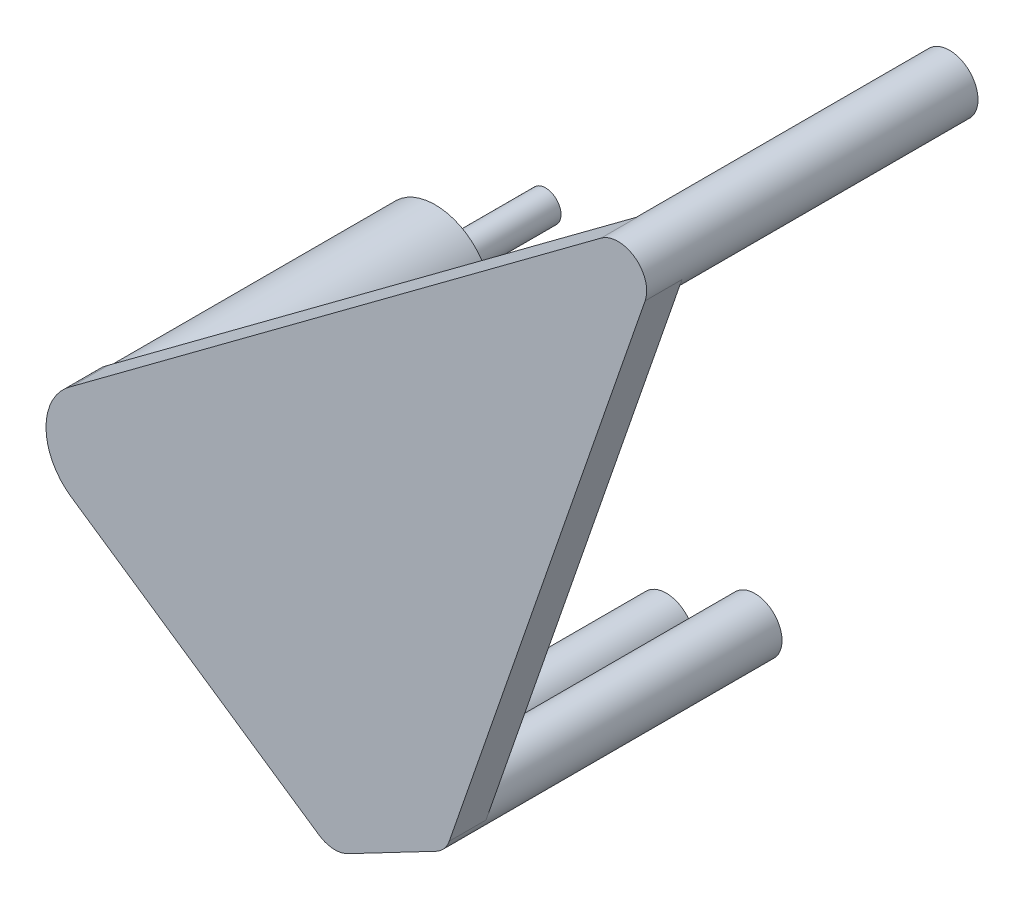
ISO-10303-21;
HEADER;
FILE_DESCRIPTION(('STEP AP214'),'2;1');
FILE_NAME('part.step','',(''),(''),'','','');
FILE_SCHEMA(('AUTOMOTIVE_DESIGN { 1 0 10303 214 1 1 1 1 }'));
ENDSEC;
DATA;
#1=APPLICATION_CONTEXT('core data for automotive mechanical design processes');
#2=APPLICATION_PROTOCOL_DEFINITION('international standard','automotive_design',2000,#1);
#3=PRODUCT_CONTEXT('',#1,'mechanical');
#4=PRODUCT('Part','Part','',(#3));
#5=PRODUCT_RELATED_PRODUCT_CATEGORY('part','',(#4));
#6=PRODUCT_DEFINITION_FORMATION('','',#4);
#7=PRODUCT_DEFINITION_CONTEXT('part definition',#1,'design');
#8=PRODUCT_DEFINITION('design','',#6,#7);
#9=PRODUCT_DEFINITION_SHAPE('','',#8);
#10=(LENGTH_UNIT() NAMED_UNIT(*) SI_UNIT(.MILLI.,.METRE.));
#11=(NAMED_UNIT(*) PLANE_ANGLE_UNIT() SI_UNIT($,.RADIAN.));
#12=(NAMED_UNIT(*) SI_UNIT($,.STERADIAN.) SOLID_ANGLE_UNIT());
#13=UNCERTAINTY_MEASURE_WITH_UNIT(LENGTH_MEASURE(1.E-05),#10,'distance_accuracy_value','');
#14=(GEOMETRIC_REPRESENTATION_CONTEXT(3) GLOBAL_UNCERTAINTY_ASSIGNED_CONTEXT((#13)) GLOBAL_UNIT_ASSIGNED_CONTEXT((#10,
#11,#12)) REPRESENTATION_CONTEXT('',''));
#15=CARTESIAN_POINT('',(0.,0.,0.));
#16=DIRECTION('',(0.,0.,1.));
#17=DIRECTION('',(1.,0.,0.));
#18=AXIS2_PLACEMENT_3D('',#15,#16,#17);
#19=CARTESIAN_POINT('',(0.,0.,35.7505));
#20=DIRECTION('',(0.,0.,1.));
#21=DIRECTION('',(1.,0.,0.));
#22=AXIS2_PLACEMENT_3D('',#19,#20,#21);
#23=PLANE('',#22);
#24=CARTESIAN_POINT('',(-135.98996462201,14.8069678189548,35.7505));
#25=DIRECTION('',(0.,0.,1.));
#26=DIRECTION('',(1.,0.,0.));
#27=AXIS2_PLACEMENT_3D('',#24,#25,#26);
#28=CIRCLE('',#27,14.5);
#29=CARTESIAN_POINT('',(-121.48996462201,14.8069678189548,35.7505));
#30=VERTEX_POINT('',#29);
#31=EDGE_CURVE('E182',#30,#30,#28,.T.);
#32=ORIENTED_EDGE('',*,*,#31,.T.);
#33=EDGE_LOOP('',(#32));
#34=FACE_BOUND('',#33,.T.);
#35=CARTESIAN_POINT('',(-2.84319901034025,123.138021162855,35.7505));
#36=DIRECTION('',(0.,0.,1.));
#37=DIRECTION('',(1.,0.,0.));
#38=AXIS2_PLACEMENT_3D('',#35,#36,#37);
#39=CIRCLE('',#38,7.40503170518328);
#40=CARTESIAN_POINT('',(4.15447512995117,120.715821505298,35.7505));
#41=VERTEX_POINT('',#40);
#42=CARTESIAN_POINT('',(-7.25833485906466,129.082856736029,35.7505));
#43=VERTEX_POINT('',#42);
#44=EDGE_CURVE('E45',#41,#43,#39,.F.);
#45=ORIENTED_EDGE('',*,*,#44,.F.);
#46=DIRECTION('',(0.327101861813902,0.944989085650136,0.));
#47=VECTOR('',#46,1.);
#48=CARTESIAN_POINT('',(-33.6042241942555,11.6318849240364,35.7505));
#49=LINE('',#48,#47);
#50=CARTESIAN_POINT('',(-46.5758038889972,-25.8426839065925,35.7505));
#51=VERTEX_POINT('',#50);
#52=EDGE_CURVE('E138',#51,#41,#49,.T.);
#53=ORIENTED_EDGE('',*,*,#52,.F.);
#54=CARTESIAN_POINT('',(-53.2361349334904,-23.5372533804274,35.7505));
#55=DIRECTION('',(0.,0.,1.));
#56=DIRECTION('',(1.,0.,0.));
#57=AXIS2_PLACEMENT_3D('',#54,#55,#56);
#58=CIRCLE('',#57,7.04805076125397);
#59=CARTESIAN_POINT('',(-49.9662161408965,-29.7808621624583,35.7505));
#60=VERTEX_POINT('',#59);
#61=EDGE_CURVE('E187',#60,#51,#58,.F.);
#62=ORIENTED_EDGE('',*,*,#61,.F.);
#63=DIRECTION('',(0.885863197290606,0.46394654399625,0.));
#64=VECTOR('',#63,1.);
#65=CARTESIAN_POINT('',(1.48468298043132,-2.83486541505193,35.7505));
#66=LINE('',#65,#64);
#67=CARTESIAN_POINT('',(-72.768932332621,-41.7231591257302,35.7505));
#68=VERTEX_POINT('',#67);
#69=EDGE_CURVE('E155',#68,#60,#66,.T.);
#70=ORIENTED_EDGE('',*,*,#69,.F.);
#71=CARTESIAN_POINT('',(-76.1757268505461,-35.2181987521369,35.7505));
#72=DIRECTION('',(0.,0.,1.));
#73=DIRECTION('',(1.,0.,0.));
#74=AXIS2_PLACEMENT_3D('',#71,#72,#73);
#75=CIRCLE('',#74,7.34307553749678);
#76=CARTESIAN_POINT('',(-80.3107623465941,-41.2863318913986,35.7505));
#77=VERTEX_POINT('',#76);
#78=EDGE_CURVE('E124',#77,#68,#75,.F.);
#79=ORIENTED_EDGE('',*,*,#78,.F.);
#80=DIRECTION('',(-0.826374876341027,0.563120381226211,0.));
#81=VECTOR('',#80,1.);
#82=CARTESIAN_POINT('',(-44.6794433362743,-65.5667432629609,35.7505));
#83=LINE('',#82,#81);
#84=CARTESIAN_POINT('',(-144.436770340403,2.41134467383937,35.7505));
#85=VERTEX_POINT('',#84);
#86=EDGE_CURVE('E151',#77,#85,#83,.T.);
#87=ORIENTED_EDGE('',*,*,#86,.T.);
#88=CARTESIAN_POINT('',(-135.98996462201,14.8069678189548,35.7505));
#89=DIRECTION('',(0.,0.,1.));
#90=DIRECTION('',(1.,0.,0.));
#91=AXIS2_PLACEMENT_3D('',#88,#89,#90);
#92=CIRCLE('',#91,15.);
#93=CARTESIAN_POINT('',(-144.436770340403,27.2025909640702,35.7505));
#94=VERTEX_POINT('',#93);
#95=EDGE_CURVE('E147',#94,#85,#92,.T.);
#96=ORIENTED_EDGE('',*,*,#95,.F.);
#97=DIRECTION('',(0.802810279531019,0.596234563808009,0.));
#98=VECTOR('',#97,1.);
#99=CARTESIAN_POINT('',(-64.3675245309122,86.6687600788286,35.7505));
#100=LINE('',#99,#98);
#101=EDGE_CURVE('E142',#94,#43,#100,.T.);
#102=ORIENTED_EDGE('',*,*,#101,.T.);
#103=EDGE_LOOP('',(#45,#53,#62,#70,#79,#87,#96,#102));
#104=FACE_BOUND('',#103,.T.);
#105=ADVANCED_FACE('F41',(#34,#104),#23,.F.);
#106=CARTESIAN_POINT('',(-135.98996462201,14.8069678189548,40.513));
#107=DIRECTION('',(0.,0.,-1.));
#108=DIRECTION('',(-1.,0.,0.));
#109=AXIS2_PLACEMENT_3D('',#106,#107,#108);
#110=CYLINDRICAL_SURFACE('',#109,14.5);
#111=CARTESIAN_POINT('',(-135.98996462201,14.8069678189548,-40.513));
#112=DIRECTION('',(0.,0.,1.));
#113=DIRECTION('',(1.,0.,0.));
#114=AXIS2_PLACEMENT_3D('',#111,#112,#113);
#115=CIRCLE('',#114,14.5);
#116=CARTESIAN_POINT('',(-121.48996462201,14.8069678189548,-40.513));
#117=VERTEX_POINT('',#116);
#118=EDGE_CURVE('E178',#117,#117,#115,.T.);
#119=ORIENTED_EDGE('',*,*,#118,.T.);
#120=EDGE_LOOP('',(#119));
#121=FACE_BOUND('',#120,.T.);
#122=ORIENTED_EDGE('',*,*,#31,.F.);
#123=EDGE_LOOP('',(#122));
#124=FACE_BOUND('',#123,.T.);
#125=ADVANCED_FACE('F43',(#121,#124),#110,.T.);
#126=CARTESIAN_POINT('',(0.,0.,-40.513));
#127=DIRECTION('',(0.,0.,1.));
#128=DIRECTION('',(1.,0.,0.));
#129=AXIS2_PLACEMENT_3D('',#126,#127,#128);
#130=PLANE('',#129);
#131=CARTESIAN_POINT('',(-135.98996462201,14.8069678189548,-40.513));
#132=DIRECTION('',(0.,0.,-1.));
#133=DIRECTION('',(-1.,0.,0.));
#134=AXIS2_PLACEMENT_3D('',#131,#132,#133);
#135=CIRCLE('',#134,3.99999999999999);
#136=CARTESIAN_POINT('',(-139.98996462201,14.8069678189548,-40.513));
#137=VERTEX_POINT('',#136);
#138=EDGE_CURVE('E11',#137,#137,#135,.T.);
#139=ORIENTED_EDGE('',*,*,#138,.F.);
#140=EDGE_LOOP('',(#139));
#141=FACE_BOUND('',#140,.T.);
#142=ORIENTED_EDGE('',*,*,#118,.F.);
#143=EDGE_LOOP('',(#142));
#144=FACE_BOUND('',#143,.T.);
#145=ADVANCED_FACE('F281',(#141,#144),#130,.F.);
#146=CARTESIAN_POINT('',(-33.6042241942555,11.6318849240364,45.2755));
#147=DIRECTION('',(-0.944989085650135,0.327101861813902,0.));
#148=DIRECTION('',(-0.327101861813902,-0.944989085650136,0.));
#149=AXIS2_PLACEMENT_3D('',#146,#147,#148);
#150=PLANE('',#149);
#151=ORIENTED_EDGE('',*,*,#52,.T.);
#152=DIRECTION('',(0.,0.,-1.));
#153=VECTOR('',#152,1.);
#154=CARTESIAN_POINT('',(4.15447512995117,120.715821505298,45.2755));
#155=LINE('',#154,#153);
#156=CARTESIAN_POINT('',(4.15447512995117,120.715821505298,45.2755));
#157=VERTEX_POINT('',#156);
#158=EDGE_CURVE('E175',#157,#41,#155,.T.);
#159=ORIENTED_EDGE('',*,*,#158,.F.);
#160=DIRECTION('',(0.327101861813902,0.944989085650136,0.));
#161=VECTOR('',#160,1.);
#162=CARTESIAN_POINT('',(-33.6042241942555,11.6318849240364,45.2755));
#163=LINE('',#162,#161);
#164=CARTESIAN_POINT('',(-46.5758038889972,-25.8426839065925,45.2755));
#165=VERTEX_POINT('',#164);
#166=EDGE_CURVE('E158',#165,#157,#163,.T.);
#167=ORIENTED_EDGE('',*,*,#166,.F.);
#168=DIRECTION('',(0.,0.,-1.));
#169=VECTOR('',#168,1.);
#170=CARTESIAN_POINT('',(-46.5758038889972,-25.8426839065925,45.2755));
#171=LINE('',#170,#169);
#172=EDGE_CURVE('E134',#165,#51,#171,.T.);
#173=ORIENTED_EDGE('',*,*,#172,.T.);
#174=EDGE_LOOP('',(#151,#159,#167,#173));
#175=FACE_BOUND('',#174,.T.);
#176=ADVANCED_FACE('F223',(#175),#150,.F.);
#177=CARTESIAN_POINT('',(-2.84319901034025,123.138021162855,45.2755));
#178=DIRECTION('',(0.,0.,-1.));
#179=DIRECTION('',(-1.,0.,0.));
#180=AXIS2_PLACEMENT_3D('',#177,#178,#179);
#181=CYLINDRICAL_SURFACE('',#180,7.40503170518327);
#182=ORIENTED_EDGE('',*,*,#158,.T.);
#183=ORIENTED_EDGE('',*,*,#44,.T.);
#184=DIRECTION('',(0.,0.,-1.));
#185=VECTOR('',#184,1.);
#186=CARTESIAN_POINT('',(-7.25833485906466,129.082856736029,45.2755));
#187=LINE('',#186,#185);
#188=CARTESIAN_POINT('',(-7.25833485906466,129.082856736029,45.2755));
#189=VERTEX_POINT('',#188);
#190=EDGE_CURVE('E172',#189,#43,#187,.T.);
#191=ORIENTED_EDGE('',*,*,#190,.F.);
#192=CARTESIAN_POINT('',(-2.84319901034025,123.138021162855,45.2755));
#193=DIRECTION('',(0.,0.,1.));
#194=DIRECTION('',(1.,0.,0.));
#195=AXIS2_PLACEMENT_3D('',#192,#193,#194);
#196=CIRCLE('',#195,7.40503170518327);
#197=EDGE_CURVE('E97',#157,#189,#196,.T.);
#198=ORIENTED_EDGE('',*,*,#197,.F.);
#199=EDGE_LOOP('',(#182,#183,#191,#198));
#200=FACE_BOUND('',#199,.T.);
#201=CARTESIAN_POINT('',(-2.84319901034025,123.138021162855,-40.513));
#202=DIRECTION('',(0.,0.,1.));
#203=DIRECTION('',(1.,0.,0.));
#204=AXIS2_PLACEMENT_3D('',#201,#202,#203);
#205=CIRCLE('',#204,7.40503170518328);
#206=CARTESIAN_POINT('',(4.56183269484303,123.138021162855,-40.513));
#207=VERTEX_POINT('',#206);
#208=EDGE_CURVE('E233',#207,#207,#205,.T.);
#209=ORIENTED_EDGE('',*,*,#208,.T.);
#210=EDGE_LOOP('',(#209));
#211=FACE_BOUND('',#210,.T.);
#212=ADVANCED_FACE('F193',(#200,#211),#181,.T.);
#213=CARTESIAN_POINT('',(-64.3675245309122,86.6687600788286,45.2755));
#214=DIRECTION('',(-0.596234563808009,0.802810279531019,0.));
#215=DIRECTION('',(-0.802810279531019,-0.596234563808009,0.));
#216=AXIS2_PLACEMENT_3D('',#213,#214,#215);
#217=PLANE('',#216);
#218=ORIENTED_EDGE('',*,*,#101,.F.);
#219=DIRECTION('',(0.,0.,-1.));
#220=VECTOR('',#219,1.);
#221=CARTESIAN_POINT('',(-144.436770340403,27.2025909640702,45.2755));
#222=LINE('',#221,#220);
#223=CARTESIAN_POINT('',(-144.436770340403,27.2025909640702,45.2755));
#224=VERTEX_POINT('',#223);
#225=EDGE_CURVE('E169',#224,#94,#222,.T.);
#226=ORIENTED_EDGE('',*,*,#225,.F.);
#227=DIRECTION('',(0.802810279531019,0.596234563808009,0.));
#228=VECTOR('',#227,1.);
#229=CARTESIAN_POINT('',(-64.3675245309122,86.6687600788286,45.2755));
#230=LINE('',#229,#228);
#231=EDGE_CURVE('E206',#224,#189,#230,.T.);
#232=ORIENTED_EDGE('',*,*,#231,.T.);
#233=ORIENTED_EDGE('',*,*,#190,.T.);
#234=EDGE_LOOP('',(#218,#226,#232,#233));
#235=FACE_BOUND('',#234,.T.);
#236=ADVANCED_FACE('F203',(#235),#217,.T.);
#237=CARTESIAN_POINT('',(-135.98996462201,14.8069678189548,45.2755));
#238=DIRECTION('',(0.,0.,-1.));
#239=DIRECTION('',(-1.,0.,0.));
#240=AXIS2_PLACEMENT_3D('',#237,#238,#239);
#241=CYLINDRICAL_SURFACE('',#240,15.);
#242=ORIENTED_EDGE('',*,*,#95,.T.);
#243=DIRECTION('',(0.,0.,-1.));
#244=VECTOR('',#243,1.);
#245=CARTESIAN_POINT('',(-144.436770340403,2.41134467383937,45.2755));
#246=LINE('',#245,#244);
#247=CARTESIAN_POINT('',(-144.436770340403,2.41134467383937,45.2755));
#248=VERTEX_POINT('',#247);
#249=EDGE_CURVE('E166',#248,#85,#246,.T.);
#250=ORIENTED_EDGE('',*,*,#249,.F.);
#251=CARTESIAN_POINT('',(-135.98996462201,14.8069678189548,45.2755));
#252=DIRECTION('',(0.,0.,1.));
#253=DIRECTION('',(1.,0.,0.));
#254=AXIS2_PLACEMENT_3D('',#251,#252,#253);
#255=CIRCLE('',#254,15.);
#256=EDGE_CURVE('E208',#224,#248,#255,.T.);
#257=ORIENTED_EDGE('',*,*,#256,.F.);
#258=ORIENTED_EDGE('',*,*,#225,.T.);
#259=EDGE_LOOP('',(#242,#250,#257,#258));
#260=FACE_BOUND('',#259,.T.);
#261=ADVANCED_FACE('F303',(#260),#241,.T.);
#262=CARTESIAN_POINT('',(-44.6794433362743,-65.5667432629609,45.2755));
#263=DIRECTION('',(-0.563120381226211,-0.826374876341027,0.));
#264=DIRECTION('',(0.826374876341027,-0.563120381226211,0.));
#265=AXIS2_PLACEMENT_3D('',#262,#263,#264);
#266=PLANE('',#265);
#267=ORIENTED_EDGE('',*,*,#86,.F.);
#268=DIRECTION('',(0.,0.,-1.));
#269=VECTOR('',#268,1.);
#270=CARTESIAN_POINT('',(-80.3107623465941,-41.2863318913986,45.2755));
#271=LINE('',#270,#269);
#272=CARTESIAN_POINT('',(-80.3107623465941,-41.2863318913986,45.2755));
#273=VERTEX_POINT('',#272);
#274=EDGE_CURVE('E81',#273,#77,#271,.T.);
#275=ORIENTED_EDGE('',*,*,#274,.F.);
#276=DIRECTION('',(-0.826374876341027,0.563120381226211,0.));
#277=VECTOR('',#276,1.);
#278=CARTESIAN_POINT('',(-44.6794433362743,-65.5667432629609,45.2755));
#279=LINE('',#278,#277);
#280=EDGE_CURVE('E117',#273,#248,#279,.T.);
#281=ORIENTED_EDGE('',*,*,#280,.T.);
#282=ORIENTED_EDGE('',*,*,#249,.T.);
#283=EDGE_LOOP('',(#267,#275,#281,#282));
#284=FACE_BOUND('',#283,.T.);
#285=ADVANCED_FACE('F218',(#284),#266,.T.);
#286=CARTESIAN_POINT('',(-76.1757268505461,-35.2181987521369,45.2755));
#287=DIRECTION('',(0.,0.,-1.));
#288=DIRECTION('',(-1.,0.,0.));
#289=AXIS2_PLACEMENT_3D('',#286,#287,#288);
#290=CYLINDRICAL_SURFACE('',#289,7.3430755374968);
#291=ORIENTED_EDGE('',*,*,#274,.T.);
#292=ORIENTED_EDGE('',*,*,#78,.T.);
#293=DIRECTION('',(0.,0.,-1.));
#294=VECTOR('',#293,1.);
#295=CARTESIAN_POINT('',(-72.768932332621,-41.7231591257302,45.2755));
#296=LINE('',#295,#294);
#297=CARTESIAN_POINT('',(-72.768932332621,-41.7231591257302,45.2755));
#298=VERTEX_POINT('',#297);
#299=EDGE_CURVE('E121',#298,#68,#296,.T.);
#300=ORIENTED_EDGE('',*,*,#299,.F.);
#301=CARTESIAN_POINT('',(-76.1757268505461,-35.2181987521369,45.2755));
#302=DIRECTION('',(0.,0.,1.));
#303=DIRECTION('',(1.,0.,0.));
#304=AXIS2_PLACEMENT_3D('',#301,#302,#303);
#305=CIRCLE('',#304,7.3430755374968);
#306=EDGE_CURVE('E111',#273,#298,#305,.T.);
#307=ORIENTED_EDGE('',*,*,#306,.F.);
#308=EDGE_LOOP('',(#291,#292,#300,#307));
#309=FACE_BOUND('',#308,.T.);
#310=CARTESIAN_POINT('',(-76.1757268505461,-35.2181987521369,-40.513));
#311=DIRECTION('',(0.,0.,1.));
#312=DIRECTION('',(1.,0.,0.));
#313=AXIS2_PLACEMENT_3D('',#310,#311,#312);
#314=CIRCLE('',#313,7.34307553749678);
#315=CARTESIAN_POINT('',(-68.8326513130493,-35.2181987521369,-40.513));
#316=VERTEX_POINT('',#315);
#317=EDGE_CURVE('E143',#316,#316,#314,.T.);
#318=ORIENTED_EDGE('',*,*,#317,.T.);
#319=EDGE_LOOP('',(#318));
#320=FACE_BOUND('',#319,.T.);
#321=ADVANCED_FACE('F122',(#309,#320),#290,.T.);
#322=CARTESIAN_POINT('',(1.48468298043132,-2.83486541505193,45.2755));
#323=DIRECTION('',(-0.46394654399625,0.885863197290606,0.));
#324=DIRECTION('',(-0.885863197290606,-0.46394654399625,0.));
#325=AXIS2_PLACEMENT_3D('',#322,#323,#324);
#326=PLANE('',#325);
#327=ORIENTED_EDGE('',*,*,#69,.T.);
#328=DIRECTION('',(0.,0.,-1.));
#329=VECTOR('',#328,1.);
#330=CARTESIAN_POINT('',(-49.9662161408965,-29.7808621624583,45.2755));
#331=LINE('',#330,#329);
#332=CARTESIAN_POINT('',(-49.9662161408965,-29.7808621624583,45.2755));
#333=VERTEX_POINT('',#332);
#334=EDGE_CURVE('E88',#333,#60,#331,.T.);
#335=ORIENTED_EDGE('',*,*,#334,.F.);
#336=DIRECTION('',(0.885863197290606,0.46394654399625,0.));
#337=VECTOR('',#336,1.);
#338=CARTESIAN_POINT('',(1.48468298043132,-2.83486541505193,45.2755));
#339=LINE('',#338,#337);
#340=EDGE_CURVE('E115',#298,#333,#339,.T.);
#341=ORIENTED_EDGE('',*,*,#340,.F.);
#342=ORIENTED_EDGE('',*,*,#299,.T.);
#343=EDGE_LOOP('',(#327,#335,#341,#342));
#344=FACE_BOUND('',#343,.T.);
#345=ADVANCED_FACE('F130',(#344),#326,.F.);
#346=CARTESIAN_POINT('',(-53.2361349334904,-23.5372533804274,45.2755));
#347=DIRECTION('',(0.,0.,-1.));
#348=DIRECTION('',(-1.,0.,0.));
#349=AXIS2_PLACEMENT_3D('',#346,#347,#348);
#350=CYLINDRICAL_SURFACE('',#349,7.04805076125397);
#351=ORIENTED_EDGE('',*,*,#334,.T.);
#352=ORIENTED_EDGE('',*,*,#61,.T.);
#353=ORIENTED_EDGE('',*,*,#172,.F.);
#354=CARTESIAN_POINT('',(-53.2361349334904,-23.5372533804274,45.2755));
#355=DIRECTION('',(0.,0.,1.));
#356=DIRECTION('',(1.,0.,0.));
#357=AXIS2_PLACEMENT_3D('',#354,#355,#356);
#358=CIRCLE('',#357,7.04805076125397);
#359=EDGE_CURVE('E60',#333,#165,#358,.T.);
#360=ORIENTED_EDGE('',*,*,#359,.F.);
#361=EDGE_LOOP('',(#351,#352,#353,#360));
#362=FACE_BOUND('',#361,.T.);
#363=CARTESIAN_POINT('',(-53.2361349334904,-23.5372533804274,-40.513));
#364=DIRECTION('',(0.,0.,1.));
#365=DIRECTION('',(1.,0.,0.));
#366=AXIS2_PLACEMENT_3D('',#363,#364,#365);
#367=CIRCLE('',#366,7.04805076125397);
#368=CARTESIAN_POINT('',(-46.1880841722364,-23.5372533804274,-40.513));
#369=VERTEX_POINT('',#368);
#370=EDGE_CURVE('E230',#369,#369,#367,.T.);
#371=ORIENTED_EDGE('',*,*,#370,.T.);
#372=EDGE_LOOP('',(#371));
#373=FACE_BOUND('',#372,.T.);
#374=ADVANCED_FACE('F224',(#362,#373),#350,.T.);
#375=CARTESIAN_POINT('',(0.,0.,45.2755));
#376=DIRECTION('',(0.,0.,1.));
#377=DIRECTION('',(1.,0.,0.));
#378=AXIS2_PLACEMENT_3D('',#375,#376,#377);
#379=PLANE('',#378);
#380=ORIENTED_EDGE('',*,*,#166,.T.);
#381=ORIENTED_EDGE('',*,*,#197,.T.);
#382=ORIENTED_EDGE('',*,*,#231,.F.);
#383=ORIENTED_EDGE('',*,*,#256,.T.);
#384=ORIENTED_EDGE('',*,*,#280,.F.);
#385=ORIENTED_EDGE('',*,*,#306,.T.);
#386=ORIENTED_EDGE('',*,*,#340,.T.);
#387=ORIENTED_EDGE('',*,*,#359,.T.);
#388=EDGE_LOOP('',(#380,#381,#382,#383,#384,#385,#386,#387));
#389=FACE_BOUND('',#388,.T.);
#390=ADVANCED_FACE('F113',(#389),#379,.T.);
#391=CARTESIAN_POINT('',(0.,0.,-40.513));
#392=DIRECTION('',(0.,0.,1.));
#393=DIRECTION('',(1.,0.,0.));
#394=AXIS2_PLACEMENT_3D('',#391,#392,#393);
#395=PLANE('',#394);
#396=CARTESIAN_POINT('',(-76.1757268505461,-35.2181987521369,-40.513));
#397=DIRECTION('',(0.,0.,-1.));
#398=DIRECTION('',(-1.,0.,0.));
#399=AXIS2_PLACEMENT_3D('',#396,#397,#398);
#400=CIRCLE('',#399,1.26999999999999);
#401=CARTESIAN_POINT('',(-77.4457268505461,-35.2181987521369,-40.513));
#402=VERTEX_POINT('',#401);
#403=EDGE_CURVE('E261',#402,#402,#400,.T.);
#404=ORIENTED_EDGE('',*,*,#403,.F.);
#405=EDGE_LOOP('',(#404));
#406=FACE_BOUND('',#405,.T.);
#407=ORIENTED_EDGE('',*,*,#317,.F.);
#408=EDGE_LOOP('',(#407));
#409=FACE_BOUND('',#408,.T.);
#410=ADVANCED_FACE('F351',(#406,#409),#395,.F.);
#411=CARTESIAN_POINT('',(0.,0.,-40.513));
#412=DIRECTION('',(0.,0.,1.));
#413=DIRECTION('',(1.,0.,0.));
#414=AXIS2_PLACEMENT_3D('',#411,#412,#413);
#415=PLANE('',#414);
#416=CARTESIAN_POINT('',(-53.2361349334904,-23.5372533804274,-40.513));
#417=DIRECTION('',(0.,0.,-1.));
#418=DIRECTION('',(-1.,0.,0.));
#419=AXIS2_PLACEMENT_3D('',#416,#417,#418);
#420=CIRCLE('',#419,1.27);
#421=CARTESIAN_POINT('',(-54.5061349334904,-23.5372533804274,-40.513));
#422=VERTEX_POINT('',#421);
#423=EDGE_CURVE('E244',#422,#422,#420,.T.);
#424=ORIENTED_EDGE('',*,*,#423,.F.);
#425=EDGE_LOOP('',(#424));
#426=FACE_BOUND('',#425,.T.);
#427=ORIENTED_EDGE('',*,*,#370,.F.);
#428=EDGE_LOOP('',(#427));
#429=FACE_BOUND('',#428,.T.);
#430=ADVANCED_FACE('F357',(#426,#429),#415,.F.);
#431=CARTESIAN_POINT('',(0.,0.,-40.513));
#432=DIRECTION('',(0.,0.,1.));
#433=DIRECTION('',(1.,0.,0.));
#434=AXIS2_PLACEMENT_3D('',#431,#432,#433);
#435=PLANE('',#434);
#436=CARTESIAN_POINT('',(-2.84319901034025,123.138021162855,-40.513));
#437=DIRECTION('',(0.,0.,-1.));
#438=DIRECTION('',(-1.,0.,0.));
#439=AXIS2_PLACEMENT_3D('',#436,#437,#438);
#440=CIRCLE('',#439,1.27);
#441=CARTESIAN_POINT('',(-4.11319901034025,123.138021162855,-40.513));
#442=VERTEX_POINT('',#441);
#443=EDGE_CURVE('E252',#442,#442,#440,.T.);
#444=ORIENTED_EDGE('',*,*,#443,.F.);
#445=EDGE_LOOP('',(#444));
#446=FACE_BOUND('',#445,.T.);
#447=ORIENTED_EDGE('',*,*,#208,.F.);
#448=EDGE_LOOP('',(#447));
#449=FACE_BOUND('',#448,.T.);
#450=ADVANCED_FACE('F364',(#446,#449),#435,.F.);
#451=CARTESIAN_POINT('',(-2.84319901034025,123.138021162855,-30.988));
#452=DIRECTION('',(0.,0.,-1.));
#453=DIRECTION('',(-1.,0.,0.));
#454=AXIS2_PLACEMENT_3D('',#451,#452,#453);
#455=CYLINDRICAL_SURFACE('',#454,1.27);
#456=CARTESIAN_POINT('',(-2.84319901034025,123.138021162855,-30.988));
#457=DIRECTION('',(0.,0.,-1.));
#458=DIRECTION('',(-1.,0.,0.));
#459=AXIS2_PLACEMENT_3D('',#456,#457,#458);
#460=CIRCLE('',#459,1.27);
#461=CARTESIAN_POINT('',(-4.11319901034025,123.138021162855,-30.988));
#462=VERTEX_POINT('',#461);
#463=EDGE_CURVE('E256',#462,#462,#460,.T.);
#464=CARTESIAN_POINT('',(-4.11319901034025,123.138021162855,-30.988));
#465=CARTESIAN_POINT('',(-4.11319901034025,123.138021162855,-31.08721875));
#466=CARTESIAN_POINT('',(-4.11319901034025,123.138021162855,-31.1864375));
#467=CARTESIAN_POINT('',(-4.11319901034025,123.138021162855,-31.384875));
#468=CARTESIAN_POINT('',(-4.11319901034025,123.138021162855,-31.48409375));
#469=CARTESIAN_POINT('',(-4.11319901034025,123.138021162855,-31.68253125));
#470=CARTESIAN_POINT('',(-4.11319901034025,123.138021162855,-31.78175));
#471=CARTESIAN_POINT('',(-4.11319901034025,123.138021162855,-31.9801875));
#472=CARTESIAN_POINT('',(-4.11319901034025,123.138021162855,-32.07940625));
#473=CARTESIAN_POINT('',(-4.11319901034025,123.138021162855,-32.27784375));
#474=CARTESIAN_POINT('',(-4.11319901034025,123.138021162855,-32.3770625));
#475=CARTESIAN_POINT('',(-4.11319901034025,123.138021162855,-32.5755));
#476=CARTESIAN_POINT('',(-4.11319901034025,123.138021162855,-32.67471875));
#477=CARTESIAN_POINT('',(-4.11319901034025,123.138021162855,-32.87315625));
#478=CARTESIAN_POINT('',(-4.11319901034025,123.138021162855,-32.972375));
#479=CARTESIAN_POINT('',(-4.11319901034025,123.138021162855,-33.1708125));
#480=CARTESIAN_POINT('',(-4.11319901034025,123.138021162855,-33.27003125));
#481=CARTESIAN_POINT('',(-4.11319901034025,123.138021162855,-33.46846875));
#482=CARTESIAN_POINT('',(-4.11319901034025,123.138021162855,-33.5676875));
#483=CARTESIAN_POINT('',(-4.11319901034025,123.138021162855,-33.766125));
#484=CARTESIAN_POINT('',(-4.11319901034025,123.138021162855,-33.86534375));
#485=CARTESIAN_POINT('',(-4.11319901034025,123.138021162855,-34.06378125));
#486=CARTESIAN_POINT('',(-4.11319901034025,123.138021162855,-34.163));
#487=CARTESIAN_POINT('',(-4.11319901034025,123.138021162855,-34.3614375));
#488=CARTESIAN_POINT('',(-4.11319901034025,123.138021162855,-34.46065625));
#489=CARTESIAN_POINT('',(-4.11319901034025,123.138021162855,-34.65909375));
#490=CARTESIAN_POINT('',(-4.11319901034025,123.138021162855,-34.7583125));
#491=CARTESIAN_POINT('',(-4.11319901034025,123.138021162855,-34.95675));
#492=CARTESIAN_POINT('',(-4.11319901034025,123.138021162855,-35.05596875));
#493=CARTESIAN_POINT('',(-4.11319901034025,123.138021162855,-35.25440625));
#494=CARTESIAN_POINT('',(-4.11319901034025,123.138021162855,-35.353625));
#495=CARTESIAN_POINT('',(-4.11319901034025,123.138021162855,-35.5520625));
#496=CARTESIAN_POINT('',(-4.11319901034025,123.138021162855,-35.65128125));
#497=CARTESIAN_POINT('',(-4.11319901034025,123.138021162855,-35.84971875));
#498=CARTESIAN_POINT('',(-4.11319901034025,123.138021162855,-35.9489375));
#499=CARTESIAN_POINT('',(-4.11319901034025,123.138021162855,-36.147375));
#500=CARTESIAN_POINT('',(-4.11319901034025,123.138021162855,-36.24659375));
#501=CARTESIAN_POINT('',(-4.11319901034025,123.138021162855,-36.44503125));
#502=CARTESIAN_POINT('',(-4.11319901034025,123.138021162855,-36.54425));
#503=CARTESIAN_POINT('',(-4.11319901034025,123.138021162855,-36.7426875));
#504=CARTESIAN_POINT('',(-4.11319901034025,123.138021162855,-36.84190625));
#505=CARTESIAN_POINT('',(-4.11319901034025,123.138021162855,-37.04034375));
#506=CARTESIAN_POINT('',(-4.11319901034025,123.138021162855,-37.1395625));
#507=CARTESIAN_POINT('',(-4.11319901034025,123.138021162855,-37.338));
#508=CARTESIAN_POINT('',(-4.11319901034025,123.138021162855,-37.43721875));
#509=CARTESIAN_POINT('',(-4.11319901034025,123.138021162855,-37.63565625));
#510=CARTESIAN_POINT('',(-4.11319901034025,123.138021162855,-37.734875));
#511=CARTESIAN_POINT('',(-4.11319901034025,123.138021162855,-37.9333125));
#512=CARTESIAN_POINT('',(-4.11319901034025,123.138021162855,-38.03253125));
#513=CARTESIAN_POINT('',(-4.11319901034025,123.138021162855,-38.23096875));
#514=CARTESIAN_POINT('',(-4.11319901034025,123.138021162855,-38.3301875));
#515=CARTESIAN_POINT('',(-4.11319901034025,123.138021162855,-38.528625));
#516=CARTESIAN_POINT('',(-4.11319901034025,123.138021162855,-38.62784375));
#517=CARTESIAN_POINT('',(-4.11319901034025,123.138021162855,-38.82628125));
#518=CARTESIAN_POINT('',(-4.11319901034025,123.138021162855,-38.9255));
#519=CARTESIAN_POINT('',(-4.11319901034025,123.138021162855,-39.1239375));
#520=CARTESIAN_POINT('',(-4.11319901034025,123.138021162855,-39.22315625));
#521=CARTESIAN_POINT('',(-4.11319901034025,123.138021162855,-39.42159375));
#522=CARTESIAN_POINT('',(-4.11319901034025,123.138021162855,-39.5208125));
#523=CARTESIAN_POINT('',(-4.11319901034025,123.138021162855,-39.71925));
#524=CARTESIAN_POINT('',(-4.11319901034025,123.138021162855,-39.81846875));
#525=CARTESIAN_POINT('',(-4.11319901034025,123.138021162855,-40.01690625));
#526=CARTESIAN_POINT('',(-4.11319901034025,123.138021162855,-40.116125));
#527=CARTESIAN_POINT('',(-4.11319901034025,123.138021162855,-40.3145625));
#528=CARTESIAN_POINT('',(-4.11319901034025,123.138021162855,-40.41378125));
#529=CARTESIAN_POINT('',(-4.11319901034025,123.138021162855,-40.513));
#530=B_SPLINE_CURVE_WITH_KNOTS('',3,(#464,#465,#466,#467,#468,#469,#470,#471,#472,#473,#474,
#475,#476,#477,#478,#479,#480,#481,#482,#483,#484,#485,#486,#487,#488,#489,#490,#491,#492,#493,
#494,#495,#496,#497,#498,#499,#500,#501,#502,#503,#504,#505,#506,#507,#508,#509,#510,#511,#512,
#513,#514,#515,#516,#517,#518,#519,#520,#521,#522,#523,#524,#525,#526,#527,#528,#529),
.UNSPECIFIED.,.F.,.F.,(4,2,2,2,2,2,2,2,2,2,2,2,2,2,2,2,2,2,2,2,2,2,2,2,2,2,2,2,2,2,2,2,4),(0.,
0.297656250000004,0.595312500000004,0.892968750000004,1.190625,1.48828125,1.7859375,2.08359375,
2.38125,2.67890625000001,2.9765625,3.27421875,3.571875,3.86953125,4.1671875,4.46484375,4.7625,
5.06015625,5.3578125,5.65546875,5.953125,6.25078125,6.5484375,6.84609375,7.14375,7.44140625,
7.7390625,8.03671875,8.334375,8.63203125,8.9296875,9.22734375,9.525),.UNSPECIFIED.);
#531=EDGE_CURVE('BSEAM372',#462,#442,#530,.T.);
#532=ORIENTED_EDGE('',*,*,#463,.F.);
#533=ORIENTED_EDGE('',*,*,#443,.T.);
#534=ORIENTED_EDGE('',*,*,#531,.T.);
#535=ORIENTED_EDGE('',*,*,#531,.F.);
#536=EDGE_LOOP('',(#532,#534,#533,#535));
#537=FACE_BOUND('',#536,.T.);
#538=ADVANCED_FACE('F372',(#537),#455,.F.);
#539=CARTESIAN_POINT('',(-2.84319901034025,123.138021162855,-30.988));
#540=DIRECTION('',(0.,0.,-1.));
#541=DIRECTION('',(-1.,0.,0.));
#542=AXIS2_PLACEMENT_3D('',#539,#540,#541);
#543=PLANE('',#542);
#544=ORIENTED_EDGE('',*,*,#463,.T.);
#545=EDGE_LOOP('',(#544));
#546=FACE_BOUND('',#545,.T.);
#547=ADVANCED_FACE('F380',(#546),#543,.T.);
#548=CARTESIAN_POINT('',(-53.2361349334904,-23.5372533804274,-30.988));
#549=DIRECTION('',(0.,0.,-1.));
#550=DIRECTION('',(-1.,0.,0.));
#551=AXIS2_PLACEMENT_3D('',#548,#549,#550);
#552=CYLINDRICAL_SURFACE('',#551,1.27);
#553=CARTESIAN_POINT('',(-53.2361349334904,-23.5372533804274,-30.988));
#554=DIRECTION('',(0.,0.,-1.));
#555=DIRECTION('',(-1.,0.,0.));
#556=AXIS2_PLACEMENT_3D('',#553,#554,#555);
#557=CIRCLE('',#556,1.27);
#558=CARTESIAN_POINT('',(-54.5061349334904,-23.5372533804274,-30.988));
#559=VERTEX_POINT('',#558);
#560=EDGE_CURVE('E240',#559,#559,#557,.T.);
#561=CARTESIAN_POINT('',(-54.5061349334904,-23.5372533804274,-30.988));
#562=CARTESIAN_POINT('',(-54.5061349334904,-23.5372533804274,-31.08721875));
#563=CARTESIAN_POINT('',(-54.5061349334904,-23.5372533804274,-31.1864375));
#564=CARTESIAN_POINT('',(-54.5061349334904,-23.5372533804274,-31.384875));
#565=CARTESIAN_POINT('',(-54.5061349334904,-23.5372533804274,-31.48409375));
#566=CARTESIAN_POINT('',(-54.5061349334904,-23.5372533804274,-31.68253125));
#567=CARTESIAN_POINT('',(-54.5061349334904,-23.5372533804274,-31.78175));
#568=CARTESIAN_POINT('',(-54.5061349334904,-23.5372533804274,-31.9801875));
#569=CARTESIAN_POINT('',(-54.5061349334904,-23.5372533804274,-32.07940625));
#570=CARTESIAN_POINT('',(-54.5061349334904,-23.5372533804274,-32.27784375));
#571=CARTESIAN_POINT('',(-54.5061349334904,-23.5372533804274,-32.3770625));
#572=CARTESIAN_POINT('',(-54.5061349334904,-23.5372533804274,-32.5755));
#573=CARTESIAN_POINT('',(-54.5061349334904,-23.5372533804274,-32.67471875));
#574=CARTESIAN_POINT('',(-54.5061349334904,-23.5372533804274,-32.87315625));
#575=CARTESIAN_POINT('',(-54.5061349334904,-23.5372533804274,-32.972375));
#576=CARTESIAN_POINT('',(-54.5061349334904,-23.5372533804274,-33.1708125));
#577=CARTESIAN_POINT('',(-54.5061349334904,-23.5372533804274,-33.27003125));
#578=CARTESIAN_POINT('',(-54.5061349334904,-23.5372533804274,-33.46846875));
#579=CARTESIAN_POINT('',(-54.5061349334904,-23.5372533804274,-33.5676875));
#580=CARTESIAN_POINT('',(-54.5061349334904,-23.5372533804274,-33.766125));
#581=CARTESIAN_POINT('',(-54.5061349334904,-23.5372533804274,-33.86534375));
#582=CARTESIAN_POINT('',(-54.5061349334904,-23.5372533804274,-34.06378125));
#583=CARTESIAN_POINT('',(-54.5061349334904,-23.5372533804274,-34.163));
#584=CARTESIAN_POINT('',(-54.5061349334904,-23.5372533804274,-34.3614375));
#585=CARTESIAN_POINT('',(-54.5061349334904,-23.5372533804274,-34.46065625));
#586=CARTESIAN_POINT('',(-54.5061349334904,-23.5372533804274,-34.65909375));
#587=CARTESIAN_POINT('',(-54.5061349334904,-23.5372533804274,-34.7583125));
#588=CARTESIAN_POINT('',(-54.5061349334904,-23.5372533804274,-34.95675));
#589=CARTESIAN_POINT('',(-54.5061349334904,-23.5372533804274,-35.05596875));
#590=CARTESIAN_POINT('',(-54.5061349334904,-23.5372533804274,-35.25440625));
#591=CARTESIAN_POINT('',(-54.5061349334904,-23.5372533804274,-35.353625));
#592=CARTESIAN_POINT('',(-54.5061349334904,-23.5372533804274,-35.5520625));
#593=CARTESIAN_POINT('',(-54.5061349334904,-23.5372533804274,-35.65128125));
#594=CARTESIAN_POINT('',(-54.5061349334904,-23.5372533804274,-35.84971875));
#595=CARTESIAN_POINT('',(-54.5061349334904,-23.5372533804274,-35.9489375));
#596=CARTESIAN_POINT('',(-54.5061349334904,-23.5372533804274,-36.147375));
#597=CARTESIAN_POINT('',(-54.5061349334904,-23.5372533804274,-36.24659375));
#598=CARTESIAN_POINT('',(-54.5061349334904,-23.5372533804274,-36.44503125));
#599=CARTESIAN_POINT('',(-54.5061349334904,-23.5372533804274,-36.54425));
#600=CARTESIAN_POINT('',(-54.5061349334904,-23.5372533804274,-36.7426875));
#601=CARTESIAN_POINT('',(-54.5061349334904,-23.5372533804274,-36.84190625));
#602=CARTESIAN_POINT('',(-54.5061349334904,-23.5372533804274,-37.04034375));
#603=CARTESIAN_POINT('',(-54.5061349334904,-23.5372533804274,-37.1395625));
#604=CARTESIAN_POINT('',(-54.5061349334904,-23.5372533804274,-37.338));
#605=CARTESIAN_POINT('',(-54.5061349334904,-23.5372533804274,-37.43721875));
#606=CARTESIAN_POINT('',(-54.5061349334904,-23.5372533804274,-37.63565625));
#607=CARTESIAN_POINT('',(-54.5061349334904,-23.5372533804274,-37.734875));
#608=CARTESIAN_POINT('',(-54.5061349334904,-23.5372533804274,-37.9333125));
#609=CARTESIAN_POINT('',(-54.5061349334904,-23.5372533804274,-38.03253125));
#610=CARTESIAN_POINT('',(-54.5061349334904,-23.5372533804274,-38.23096875));
#611=CARTESIAN_POINT('',(-54.5061349334904,-23.5372533804274,-38.3301875));
#612=CARTESIAN_POINT('',(-54.5061349334904,-23.5372533804274,-38.528625));
#613=CARTESIAN_POINT('',(-54.5061349334904,-23.5372533804274,-38.62784375));
#614=CARTESIAN_POINT('',(-54.5061349334904,-23.5372533804274,-38.82628125));
#615=CARTESIAN_POINT('',(-54.5061349334904,-23.5372533804274,-38.9255));
#616=CARTESIAN_POINT('',(-54.5061349334904,-23.5372533804274,-39.1239375));
#617=CARTESIAN_POINT('',(-54.5061349334904,-23.5372533804274,-39.22315625));
#618=CARTESIAN_POINT('',(-54.5061349334904,-23.5372533804274,-39.42159375));
#619=CARTESIAN_POINT('',(-54.5061349334904,-23.5372533804274,-39.5208125));
#620=CARTESIAN_POINT('',(-54.5061349334904,-23.5372533804274,-39.71925));
#621=CARTESIAN_POINT('',(-54.5061349334904,-23.5372533804274,-39.81846875));
#622=CARTESIAN_POINT('',(-54.5061349334904,-23.5372533804274,-40.01690625));
#623=CARTESIAN_POINT('',(-54.5061349334904,-23.5372533804274,-40.116125));
#624=CARTESIAN_POINT('',(-54.5061349334904,-23.5372533804274,-40.3145625));
#625=CARTESIAN_POINT('',(-54.5061349334904,-23.5372533804274,-40.41378125));
#626=CARTESIAN_POINT('',(-54.5061349334904,-23.5372533804274,-40.513));
#627=B_SPLINE_CURVE_WITH_KNOTS('',3,(#561,#562,#563,#564,#565,#566,#567,#568,#569,#570,#571,
#572,#573,#574,#575,#576,#577,#578,#579,#580,#581,#582,#583,#584,#585,#586,#587,#588,#589,#590,
#591,#592,#593,#594,#595,#596,#597,#598,#599,#600,#601,#602,#603,#604,#605,#606,#607,#608,#609,
#610,#611,#612,#613,#614,#615,#616,#617,#618,#619,#620,#621,#622,#623,#624,#625,#626),
.UNSPECIFIED.,.F.,.F.,(4,2,2,2,2,2,2,2,2,2,2,2,2,2,2,2,2,2,2,2,2,2,2,2,2,2,2,2,2,2,2,2,4),(0.,
0.297656250000004,0.595312500000004,0.892968750000004,1.190625,1.48828125,1.7859375,2.08359375,
2.38125,2.67890625000001,2.9765625,3.27421875,3.571875,3.86953125,4.1671875,4.46484375,4.7625,
5.06015625,5.3578125,5.65546875,5.953125,6.25078125,6.5484375,6.84609375,7.14375,7.44140625,
7.7390625,8.03671875,8.334375,8.63203125,8.9296875,9.22734375,9.525),.UNSPECIFIED.);
#628=EDGE_CURVE('BSEAM388',#559,#422,#627,.T.);
#629=ORIENTED_EDGE('',*,*,#560,.F.);
#630=ORIENTED_EDGE('',*,*,#423,.T.);
#631=ORIENTED_EDGE('',*,*,#628,.T.);
#632=ORIENTED_EDGE('',*,*,#628,.F.);
#633=EDGE_LOOP('',(#629,#631,#630,#632));
#634=FACE_BOUND('',#633,.T.);
#635=ADVANCED_FACE('F388',(#634),#552,.F.);
#636=CARTESIAN_POINT('',(-53.2361349334904,-23.5372533804274,-30.988));
#637=DIRECTION('',(0.,0.,-1.));
#638=DIRECTION('',(-1.,0.,0.));
#639=AXIS2_PLACEMENT_3D('',#636,#637,#638);
#640=PLANE('',#639);
#641=ORIENTED_EDGE('',*,*,#560,.T.);
#642=EDGE_LOOP('',(#641));
#643=FACE_BOUND('',#642,.T.);
#644=ADVANCED_FACE('F396',(#643),#640,.T.);
#645=CARTESIAN_POINT('',(-76.1757268505461,-35.2181987521369,-30.988));
#646=DIRECTION('',(0.,0.,-1.));
#647=DIRECTION('',(-1.,0.,0.));
#648=AXIS2_PLACEMENT_3D('',#645,#646,#647);
#649=CYLINDRICAL_SURFACE('',#648,1.26999999999999);
#650=CARTESIAN_POINT('',(-76.1757268505461,-35.2181987521369,-30.988));
#651=DIRECTION('',(0.,0.,-1.));
#652=DIRECTION('',(-1.,0.,0.));
#653=AXIS2_PLACEMENT_3D('',#650,#651,#652);
#654=CIRCLE('',#653,1.26999999999999);
#655=CARTESIAN_POINT('',(-77.4457268505461,-35.2181987521369,-30.988));
#656=VERTEX_POINT('',#655);
#657=EDGE_CURVE('E248',#656,#656,#654,.T.);
#658=CARTESIAN_POINT('',(-77.4457268505461,-35.2181987521369,-30.988));
#659=CARTESIAN_POINT('',(-77.4457268505461,-35.2181987521369,-31.08721875));
#660=CARTESIAN_POINT('',(-77.4457268505461,-35.2181987521369,-31.1864375));
#661=CARTESIAN_POINT('',(-77.4457268505461,-35.2181987521369,-31.384875));
#662=CARTESIAN_POINT('',(-77.4457268505461,-35.2181987521369,-31.48409375));
#663=CARTESIAN_POINT('',(-77.4457268505461,-35.2181987521369,-31.68253125));
#664=CARTESIAN_POINT('',(-77.4457268505461,-35.2181987521369,-31.78175));
#665=CARTESIAN_POINT('',(-77.4457268505461,-35.2181987521369,-31.9801875));
#666=CARTESIAN_POINT('',(-77.4457268505461,-35.2181987521369,-32.07940625));
#667=CARTESIAN_POINT('',(-77.4457268505461,-35.2181987521369,-32.27784375));
#668=CARTESIAN_POINT('',(-77.4457268505461,-35.2181987521369,-32.3770625));
#669=CARTESIAN_POINT('',(-77.4457268505461,-35.2181987521369,-32.5755));
#670=CARTESIAN_POINT('',(-77.4457268505461,-35.2181987521369,-32.67471875));
#671=CARTESIAN_POINT('',(-77.4457268505461,-35.2181987521369,-32.87315625));
#672=CARTESIAN_POINT('',(-77.4457268505461,-35.2181987521369,-32.972375));
#673=CARTESIAN_POINT('',(-77.4457268505461,-35.2181987521369,-33.1708125));
#674=CARTESIAN_POINT('',(-77.4457268505461,-35.2181987521369,-33.27003125));
#675=CARTESIAN_POINT('',(-77.4457268505461,-35.2181987521369,-33.46846875));
#676=CARTESIAN_POINT('',(-77.4457268505461,-35.2181987521369,-33.5676875));
#677=CARTESIAN_POINT('',(-77.4457268505461,-35.2181987521369,-33.766125));
#678=CARTESIAN_POINT('',(-77.4457268505461,-35.2181987521369,-33.86534375));
#679=CARTESIAN_POINT('',(-77.4457268505461,-35.2181987521369,-34.06378125));
#680=CARTESIAN_POINT('',(-77.4457268505461,-35.2181987521369,-34.163));
#681=CARTESIAN_POINT('',(-77.4457268505461,-35.2181987521369,-34.3614375));
#682=CARTESIAN_POINT('',(-77.4457268505461,-35.2181987521369,-34.46065625));
#683=CARTESIAN_POINT('',(-77.4457268505461,-35.2181987521369,-34.65909375));
#684=CARTESIAN_POINT('',(-77.4457268505461,-35.2181987521369,-34.7583125));
#685=CARTESIAN_POINT('',(-77.4457268505461,-35.2181987521369,-34.95675));
#686=CARTESIAN_POINT('',(-77.4457268505461,-35.2181987521369,-35.05596875));
#687=CARTESIAN_POINT('',(-77.4457268505461,-35.2181987521369,-35.25440625));
#688=CARTESIAN_POINT('',(-77.4457268505461,-35.2181987521369,-35.353625));
#689=CARTESIAN_POINT('',(-77.4457268505461,-35.2181987521369,-35.5520625));
#690=CARTESIAN_POINT('',(-77.4457268505461,-35.2181987521369,-35.65128125));
#691=CARTESIAN_POINT('',(-77.4457268505461,-35.2181987521369,-35.84971875));
#692=CARTESIAN_POINT('',(-77.4457268505461,-35.2181987521369,-35.9489375));
#693=CARTESIAN_POINT('',(-77.4457268505461,-35.2181987521369,-36.147375));
#694=CARTESIAN_POINT('',(-77.4457268505461,-35.2181987521369,-36.24659375));
#695=CARTESIAN_POINT('',(-77.4457268505461,-35.2181987521369,-36.44503125));
#696=CARTESIAN_POINT('',(-77.4457268505461,-35.2181987521369,-36.54425));
#697=CARTESIAN_POINT('',(-77.4457268505461,-35.2181987521369,-36.7426875));
#698=CARTESIAN_POINT('',(-77.4457268505461,-35.2181987521369,-36.84190625));
#699=CARTESIAN_POINT('',(-77.4457268505461,-35.2181987521369,-37.04034375));
#700=CARTESIAN_POINT('',(-77.4457268505461,-35.2181987521369,-37.1395625));
#701=CARTESIAN_POINT('',(-77.4457268505461,-35.2181987521369,-37.338));
#702=CARTESIAN_POINT('',(-77.4457268505461,-35.2181987521369,-37.43721875));
#703=CARTESIAN_POINT('',(-77.4457268505461,-35.2181987521369,-37.63565625));
#704=CARTESIAN_POINT('',(-77.4457268505461,-35.2181987521369,-37.734875));
#705=CARTESIAN_POINT('',(-77.4457268505461,-35.2181987521369,-37.9333125));
#706=CARTESIAN_POINT('',(-77.4457268505461,-35.2181987521369,-38.03253125));
#707=CARTESIAN_POINT('',(-77.4457268505461,-35.2181987521369,-38.23096875));
#708=CARTESIAN_POINT('',(-77.4457268505461,-35.2181987521369,-38.3301875));
#709=CARTESIAN_POINT('',(-77.4457268505461,-35.2181987521369,-38.528625));
#710=CARTESIAN_POINT('',(-77.4457268505461,-35.2181987521369,-38.62784375));
#711=CARTESIAN_POINT('',(-77.4457268505461,-35.2181987521369,-38.82628125));
#712=CARTESIAN_POINT('',(-77.4457268505461,-35.2181987521369,-38.9255));
#713=CARTESIAN_POINT('',(-77.4457268505461,-35.2181987521369,-39.1239375));
#714=CARTESIAN_POINT('',(-77.4457268505461,-35.2181987521369,-39.22315625));
#715=CARTESIAN_POINT('',(-77.4457268505461,-35.2181987521369,-39.42159375));
#716=CARTESIAN_POINT('',(-77.4457268505461,-35.2181987521369,-39.5208125));
#717=CARTESIAN_POINT('',(-77.4457268505461,-35.2181987521369,-39.71925));
#718=CARTESIAN_POINT('',(-77.4457268505461,-35.2181987521369,-39.81846875));
#719=CARTESIAN_POINT('',(-77.4457268505461,-35.2181987521369,-40.01690625));
#720=CARTESIAN_POINT('',(-77.4457268505461,-35.2181987521369,-40.116125));
#721=CARTESIAN_POINT('',(-77.4457268505461,-35.2181987521369,-40.3145625));
#722=CARTESIAN_POINT('',(-77.4457268505461,-35.2181987521369,-40.41378125));
#723=CARTESIAN_POINT('',(-77.4457268505461,-35.2181987521369,-40.513));
#724=B_SPLINE_CURVE_WITH_KNOTS('',3,(#658,#659,#660,#661,#662,#663,#664,#665,#666,#667,#668,
#669,#670,#671,#672,#673,#674,#675,#676,#677,#678,#679,#680,#681,#682,#683,#684,#685,#686,#687,
#688,#689,#690,#691,#692,#693,#694,#695,#696,#697,#698,#699,#700,#701,#702,#703,#704,#705,#706,
#707,#708,#709,#710,#711,#712,#713,#714,#715,#716,#717,#718,#719,#720,#721,#722,#723),
.UNSPECIFIED.,.F.,.F.,(4,2,2,2,2,2,2,2,2,2,2,2,2,2,2,2,2,2,2,2,2,2,2,2,2,2,2,2,2,2,2,2,4),(0.,
0.297656250000004,0.595312500000004,0.892968750000004,1.190625,1.48828125,1.7859375,2.08359375,
2.38125,2.67890625000001,2.9765625,3.27421875,3.571875,3.86953125,4.1671875,4.46484375,4.7625,
5.06015625,5.3578125,5.65546875,5.953125,6.25078125,6.5484375,6.84609375,7.14375,7.44140625,
7.7390625,8.03671875,8.334375,8.63203125,8.9296875,9.22734375,9.525),.UNSPECIFIED.);
#725=EDGE_CURVE('BSEAM404',#656,#402,#724,.T.);
#726=ORIENTED_EDGE('',*,*,#657,.F.);
#727=ORIENTED_EDGE('',*,*,#403,.T.);
#728=ORIENTED_EDGE('',*,*,#725,.T.);
#729=ORIENTED_EDGE('',*,*,#725,.F.);
#730=EDGE_LOOP('',(#726,#728,#727,#729));
#731=FACE_BOUND('',#730,.T.);
#732=ADVANCED_FACE('F404',(#731),#649,.F.);
#733=CARTESIAN_POINT('',(-76.1757268505461,-35.2181987521369,-30.988));
#734=DIRECTION('',(0.,0.,-1.));
#735=DIRECTION('',(-1.,0.,0.));
#736=AXIS2_PLACEMENT_3D('',#733,#734,#735);
#737=PLANE('',#736);
#738=ORIENTED_EDGE('',*,*,#657,.T.);
#739=EDGE_LOOP('',(#738));
#740=FACE_BOUND('',#739,.T.);
#741=ADVANCED_FACE('F277',(#740),#737,.T.);
#742=CARTESIAN_POINT('',(-135.98996462201,14.8069678189548,-69.088));
#743=DIRECTION('',(0.,0.,1.));
#744=DIRECTION('',(1.,0.,0.));
#745=AXIS2_PLACEMENT_3D('',#742,#743,#744);
#746=CYLINDRICAL_SURFACE('',#745,3.99999999999999);
#747=CARTESIAN_POINT('',(-135.98996462201,14.8069678189548,-69.088));
#748=DIRECTION('',(0.,0.,-1.));
#749=DIRECTION('',(-1.,0.,0.));
#750=AXIS2_PLACEMENT_3D('',#747,#748,#749);
#751=CIRCLE('',#750,3.99999999999999);
#752=CARTESIAN_POINT('',(-139.98996462201,14.8069678189548,-69.088));
#753=VERTEX_POINT('',#752);
#754=EDGE_CURVE('E257',#753,#753,#751,.T.);
#755=ORIENTED_EDGE('',*,*,#754,.F.);
#756=EDGE_LOOP('',(#755));
#757=FACE_BOUND('',#756,.T.);
#758=ORIENTED_EDGE('',*,*,#138,.T.);
#759=EDGE_LOOP('',(#758));
#760=FACE_BOUND('',#759,.T.);
#761=ADVANCED_FACE('F274',(#757,#760),#746,.T.);
#762=CARTESIAN_POINT('',(-135.98996462201,14.8069678189548,-69.088));
#763=DIRECTION('',(0.,0.,-1.));
#764=DIRECTION('',(-1.,0.,0.));
#765=AXIS2_PLACEMENT_3D('',#762,#763,#764);
#766=PLANE('',#765);
#767=ORIENTED_EDGE('',*,*,#754,.T.);
#768=EDGE_LOOP('',(#767));
#769=FACE_BOUND('',#768,.T.);
#770=ADVANCED_FACE('F272',(#769),#766,.T.);
#771=CLOSED_SHELL('',(#105,#125,#145,#176,#212,#236,#261,#285,#321,#345,#374,#390,#410,#430,
#450,#538,#547,#635,#644,#732,#741,#761,#770));
#772=MANIFOLD_SOLID_BREP('B2',#771);
#773=ADVANCED_BREP_SHAPE_REPRESENTATION('',(#18,#772),#14);
#774=SHAPE_DEFINITION_REPRESENTATION(#9,#773);
ENDSEC;
END-ISO-10303-21;
